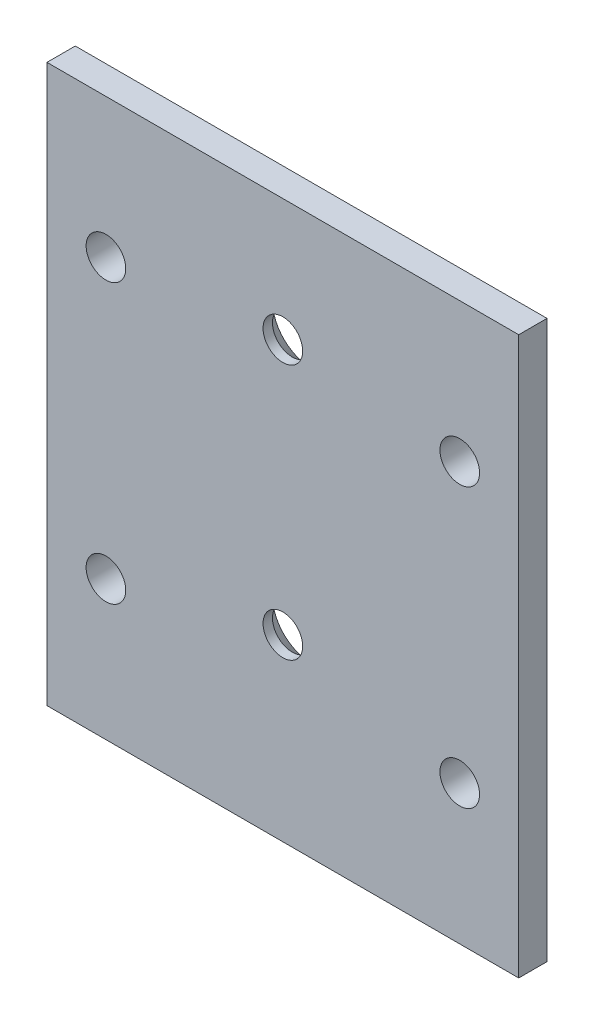
ISO-10303-21;
HEADER;
FILE_DESCRIPTION(('STEP AP214'),'2;1');
FILE_NAME('part.step','',(''),(''),'','','');
FILE_SCHEMA(('AUTOMOTIVE_DESIGN { 1 0 10303 214 1 1 1 1 }'));
ENDSEC;
DATA;
#1=APPLICATION_CONTEXT('core data for automotive mechanical design processes');
#2=APPLICATION_PROTOCOL_DEFINITION('international standard','automotive_design',2000,#1);
#3=PRODUCT_CONTEXT('',#1,'mechanical');
#4=PRODUCT('Part','Part','',(#3));
#5=PRODUCT_RELATED_PRODUCT_CATEGORY('part','',(#4));
#6=PRODUCT_DEFINITION_FORMATION('','',#4);
#7=PRODUCT_DEFINITION_CONTEXT('part definition',#1,'design');
#8=PRODUCT_DEFINITION('design','',#6,#7);
#9=PRODUCT_DEFINITION_SHAPE('','',#8);
#10=(LENGTH_UNIT() NAMED_UNIT(*) SI_UNIT(.MILLI.,.METRE.));
#11=(NAMED_UNIT(*) PLANE_ANGLE_UNIT() SI_UNIT($,.RADIAN.));
#12=(NAMED_UNIT(*) SI_UNIT($,.STERADIAN.) SOLID_ANGLE_UNIT());
#13=UNCERTAINTY_MEASURE_WITH_UNIT(LENGTH_MEASURE(1.E-05),#10,'distance_accuracy_value','');
#14=(GEOMETRIC_REPRESENTATION_CONTEXT(3) GLOBAL_UNCERTAINTY_ASSIGNED_CONTEXT((#13)) GLOBAL_UNIT_ASSIGNED_CONTEXT((#10,
#11,#12)) REPRESENTATION_CONTEXT('',''));
#15=CARTESIAN_POINT('',(0.,0.,0.));
#16=DIRECTION('',(0.,0.,1.));
#17=DIRECTION('',(1.,0.,0.));
#18=AXIS2_PLACEMENT_3D('',#15,#16,#17);
#19=CARTESIAN_POINT('',(0.,0.,3.));
#20=DIRECTION('',(0.,0.,1.));
#21=DIRECTION('',(1.,0.,0.));
#22=AXIS2_PLACEMENT_3D('',#19,#20,#21);
#23=PLANE('',#22);
#24=CARTESIAN_POINT('',(-18.75,27.5632384467491,3.));
#25=DIRECTION('',(0.,0.,1.));
#26=DIRECTION('',(-1.,0.,0.));
#27=AXIS2_PLACEMENT_3D('',#24,#25,#26);
#28=CIRCLE('',#27,2.1);
#29=CARTESIAN_POINT('',(-20.85,27.5632384467491,3.));
#30=VERTEX_POINT('',#29);
#31=EDGE_CURVE('E158',#30,#30,#28,.T.);
#32=ORIENTED_EDGE('',*,*,#31,.F.);
#33=EDGE_LOOP('',(#32));
#34=FACE_BOUND('',#33,.T.);
#35=CARTESIAN_POINT('',(18.75,57.0860055142034,3.));
#36=DIRECTION('',(0.,0.,1.));
#37=DIRECTION('',(1.,0.,0.));
#38=AXIS2_PLACEMENT_3D('',#35,#36,#37);
#39=CIRCLE('',#38,2.1);
#40=CARTESIAN_POINT('',(20.85,57.0860055142034,3.));
#41=VERTEX_POINT('',#40);
#42=EDGE_CURVE('E166',#41,#41,#39,.T.);
#43=ORIENTED_EDGE('',*,*,#42,.F.);
#44=EDGE_LOOP('',(#43));
#45=FACE_BOUND('',#44,.T.);
#46=CARTESIAN_POINT('',(0.,58.8947330899759,3.));
#47=DIRECTION('',(0.,0.,1.));
#48=DIRECTION('',(1.,0.,0.));
#49=AXIS2_PLACEMENT_3D('',#46,#47,#48);
#50=CIRCLE('',#49,2.1);
#51=CARTESIAN_POINT('',(2.1,58.8947330899759,3.));
#52=VERTEX_POINT('',#51);
#53=EDGE_CURVE('E104',#52,#52,#50,.T.);
#54=ORIENTED_EDGE('',*,*,#53,.F.);
#55=EDGE_LOOP('',(#54));
#56=FACE_BOUND('',#55,.T.);
#57=DIRECTION('',(-1.,0.,0.));
#58=VECTOR('',#57,1.);
#59=CARTESIAN_POINT('',(0.,71.8473890479305,3.));
#60=LINE('',#59,#58);
#61=CARTESIAN_POINT('',(25.,71.8473890479305,3.));
#62=VERTEX_POINT('',#61);
#63=CARTESIAN_POINT('',(-25.,71.8473890479305,3.));
#64=VERTEX_POINT('',#63);
#65=EDGE_CURVE('E50',#62,#64,#60,.T.);
#66=ORIENTED_EDGE('',*,*,#65,.T.);
#67=DIRECTION('',(0.,-1.,0.));
#68=VECTOR('',#67,1.);
#69=CARTESIAN_POINT('',(-25.,71.8473890479305,3.));
#70=LINE('',#69,#68);
#71=CARTESIAN_POINT('',(-25.,12.801854913022,3.));
#72=VERTEX_POINT('',#71);
#73=EDGE_CURVE('E81',#64,#72,#70,.T.);
#74=ORIENTED_EDGE('',*,*,#73,.T.);
#75=DIRECTION('',(1.,0.,0.));
#76=VECTOR('',#75,1.);
#77=CARTESIAN_POINT('',(-25.,12.801854913022,3.));
#78=LINE('',#77,#76);
#79=CARTESIAN_POINT('',(25.,12.801854913022,3.));
#80=VERTEX_POINT('',#79);
#81=EDGE_CURVE('E85',#72,#80,#78,.T.);
#82=ORIENTED_EDGE('',*,*,#81,.T.);
#83=DIRECTION('',(0.,1.,0.));
#84=VECTOR('',#83,1.);
#85=CARTESIAN_POINT('',(25.,71.8473890479305,3.));
#86=LINE('',#85,#84);
#87=EDGE_CURVE('E97',#80,#62,#86,.T.);
#88=ORIENTED_EDGE('',*,*,#87,.T.);
#89=EDGE_LOOP('',(#66,#74,#82,#88));
#90=FACE_BOUND('',#89,.T.);
#91=CARTESIAN_POINT('',(0.,31.8036255102108,3.));
#92=DIRECTION('',(0.,0.,1.));
#93=DIRECTION('',(1.,0.,0.));
#94=AXIS2_PLACEMENT_3D('',#91,#92,#93);
#95=CIRCLE('',#94,2.1);
#96=CARTESIAN_POINT('',(2.1,31.8036255102108,3.));
#97=VERTEX_POINT('',#96);
#98=EDGE_CURVE('E169',#97,#97,#95,.T.);
#99=ORIENTED_EDGE('',*,*,#98,.F.);
#100=EDGE_LOOP('',(#99));
#101=FACE_BOUND('',#100,.T.);
#102=CARTESIAN_POINT('',(18.75,27.5632384467491,3.));
#103=DIRECTION('',(0.,0.,1.));
#104=DIRECTION('',(1.,0.,0.));
#105=AXIS2_PLACEMENT_3D('',#102,#103,#104);
#106=CIRCLE('',#105,2.1);
#107=CARTESIAN_POINT('',(20.85,27.5632384467491,3.));
#108=VERTEX_POINT('',#107);
#109=EDGE_CURVE('E162',#108,#108,#106,.T.);
#110=ORIENTED_EDGE('',*,*,#109,.F.);
#111=EDGE_LOOP('',(#110));
#112=FACE_BOUND('',#111,.T.);
#113=CARTESIAN_POINT('',(-18.75,57.0860055142034,3.));
#114=DIRECTION('',(0.,0.,1.));
#115=DIRECTION('',(-1.,0.,0.));
#116=AXIS2_PLACEMENT_3D('',#113,#114,#115);
#117=CIRCLE('',#116,2.1);
#118=CARTESIAN_POINT('',(-20.85,57.0860055142034,3.));
#119=VERTEX_POINT('',#118);
#120=EDGE_CURVE('E153',#119,#119,#117,.T.);
#121=ORIENTED_EDGE('',*,*,#120,.F.);
#122=EDGE_LOOP('',(#121));
#123=FACE_BOUND('',#122,.T.);
#124=ADVANCED_FACE('F33',(#34,#45,#56,#90,#101,#112,#123),#23,.T.);
#125=CARTESIAN_POINT('',(0.,0.,0.));
#126=DIRECTION('',(0.,0.,1.));
#127=DIRECTION('',(1.,0.,0.));
#128=AXIS2_PLACEMENT_3D('',#125,#126,#127);
#129=PLANE('',#128);
#130=CARTESIAN_POINT('',(0.,31.8036255102108,0.));
#131=DIRECTION('',(0.,0.,1.));
#132=DIRECTION('',(1.,0.,0.));
#133=AXIS2_PLACEMENT_3D('',#130,#131,#132);
#134=CIRCLE('',#133,4.09999999999999);
#135=CARTESIAN_POINT('',(4.09999999999999,31.8036255102108,0.));
#136=VERTEX_POINT('',#135);
#137=EDGE_CURVE('E115',#136,#136,#134,.T.);
#138=ORIENTED_EDGE('',*,*,#137,.T.);
#139=EDGE_LOOP('',(#138));
#140=FACE_BOUND('',#139,.T.);
#141=CARTESIAN_POINT('',(0.,58.8947330899759,0.));
#142=DIRECTION('',(0.,0.,1.));
#143=DIRECTION('',(1.,0.,0.));
#144=AXIS2_PLACEMENT_3D('',#141,#142,#143);
#145=CIRCLE('',#144,4.09999999999999);
#146=CARTESIAN_POINT('',(4.09999999999999,58.8947330899759,0.));
#147=VERTEX_POINT('',#146);
#148=EDGE_CURVE('E112',#147,#147,#145,.T.);
#149=ORIENTED_EDGE('',*,*,#148,.T.);
#150=EDGE_LOOP('',(#149));
#151=FACE_BOUND('',#150,.T.);
#152=DIRECTION('',(0.,-1.,0.));
#153=VECTOR('',#152,1.);
#154=CARTESIAN_POINT('',(-25.,71.8473890479305,0.));
#155=LINE('',#154,#153);
#156=CARTESIAN_POINT('',(-25.,71.8473890479305,0.));
#157=VERTEX_POINT('',#156);
#158=CARTESIAN_POINT('',(-25.,12.801854913022,0.));
#159=VERTEX_POINT('',#158);
#160=EDGE_CURVE('E91',#157,#159,#155,.T.);
#161=ORIENTED_EDGE('',*,*,#160,.F.);
#162=DIRECTION('',(-1.,0.,0.));
#163=VECTOR('',#162,1.);
#164=CARTESIAN_POINT('',(0.,71.8473890479305,0.));
#165=LINE('',#164,#163);
#166=CARTESIAN_POINT('',(25.,71.8473890479305,0.));
#167=VERTEX_POINT('',#166);
#168=EDGE_CURVE('E107',#167,#157,#165,.T.);
#169=ORIENTED_EDGE('',*,*,#168,.F.);
#170=DIRECTION('',(0.,1.,0.));
#171=VECTOR('',#170,1.);
#172=CARTESIAN_POINT('',(25.,71.8473890479305,0.));
#173=LINE('',#172,#171);
#174=CARTESIAN_POINT('',(25.,12.801854913022,0.));
#175=VERTEX_POINT('',#174);
#176=EDGE_CURVE('E74',#175,#167,#173,.T.);
#177=ORIENTED_EDGE('',*,*,#176,.F.);
#178=DIRECTION('',(1.,0.,0.));
#179=VECTOR('',#178,1.);
#180=CARTESIAN_POINT('',(25.,12.801854913022,0.));
#181=LINE('',#180,#179);
#182=EDGE_CURVE('E67',#159,#175,#181,.T.);
#183=ORIENTED_EDGE('',*,*,#182,.F.);
#184=EDGE_LOOP('',(#161,#169,#177,#183));
#185=FACE_BOUND('',#184,.T.);
#186=CARTESIAN_POINT('',(18.75,57.0860055142034,0.));
#187=DIRECTION('',(0.,0.,1.));
#188=DIRECTION('',(1.,0.,0.));
#189=AXIS2_PLACEMENT_3D('',#186,#187,#188);
#190=CIRCLE('',#189,2.1);
#191=CARTESIAN_POINT('',(20.85,57.0860055142034,0.));
#192=VERTEX_POINT('',#191);
#193=EDGE_CURVE('E140',#192,#192,#190,.T.);
#194=ORIENTED_EDGE('',*,*,#193,.T.);
#195=EDGE_LOOP('',(#194));
#196=FACE_BOUND('',#195,.T.);
#197=CARTESIAN_POINT('',(18.75,27.5632384467491,0.));
#198=DIRECTION('',(0.,0.,1.));
#199=DIRECTION('',(1.,0.,0.));
#200=AXIS2_PLACEMENT_3D('',#197,#198,#199);
#201=CIRCLE('',#200,2.1);
#202=CARTESIAN_POINT('',(20.85,27.5632384467491,0.));
#203=VERTEX_POINT('',#202);
#204=EDGE_CURVE('E144',#203,#203,#201,.T.);
#205=ORIENTED_EDGE('',*,*,#204,.T.);
#206=EDGE_LOOP('',(#205));
#207=FACE_BOUND('',#206,.T.);
#208=CARTESIAN_POINT('',(-18.75,27.5632384467491,0.));
#209=DIRECTION('',(0.,0.,1.));
#210=DIRECTION('',(-1.,0.,0.));
#211=AXIS2_PLACEMENT_3D('',#208,#209,#210);
#212=CIRCLE('',#211,2.1);
#213=CARTESIAN_POINT('',(-20.85,27.5632384467491,0.));
#214=VERTEX_POINT('',#213);
#215=EDGE_CURVE('E148',#214,#214,#212,.T.);
#216=ORIENTED_EDGE('',*,*,#215,.T.);
#217=EDGE_LOOP('',(#216));
#218=FACE_BOUND('',#217,.T.);
#219=CARTESIAN_POINT('',(-18.75,57.0860055142034,0.));
#220=DIRECTION('',(0.,0.,1.));
#221=DIRECTION('',(-1.,0.,0.));
#222=AXIS2_PLACEMENT_3D('',#219,#220,#221);
#223=CIRCLE('',#222,2.1);
#224=CARTESIAN_POINT('',(-20.85,57.0860055142034,0.));
#225=VERTEX_POINT('',#224);
#226=EDGE_CURVE('E151',#225,#225,#223,.T.);
#227=ORIENTED_EDGE('',*,*,#226,.T.);
#228=EDGE_LOOP('',(#227));
#229=FACE_BOUND('',#228,.T.);
#230=ADVANCED_FACE('F129',(#140,#151,#185,#196,#207,#218,#229),#129,.F.);
#231=CARTESIAN_POINT('',(-25.,71.8473890479305,3.));
#232=DIRECTION('',(1.,0.,0.));
#233=DIRECTION('',(0.,1.,0.));
#234=AXIS2_PLACEMENT_3D('',#231,#232,#233);
#235=PLANE('',#234);
#236=ORIENTED_EDGE('',*,*,#160,.T.);
#237=DIRECTION('',(0.,0.,-1.));
#238=VECTOR('',#237,1.);
#239=CARTESIAN_POINT('',(-25.,12.801854913022,3.));
#240=LINE('',#239,#238);
#241=EDGE_CURVE('E88',#72,#159,#240,.T.);
#242=ORIENTED_EDGE('',*,*,#241,.F.);
#243=ORIENTED_EDGE('',*,*,#73,.F.);
#244=DIRECTION('',(0.,0.,-1.));
#245=VECTOR('',#244,1.);
#246=CARTESIAN_POINT('',(-25.,71.8473890479305,3.));
#247=LINE('',#246,#245);
#248=EDGE_CURVE('E92',#64,#157,#247,.T.);
#249=ORIENTED_EDGE('',*,*,#248,.T.);
#250=EDGE_LOOP('',(#236,#242,#243,#249));
#251=FACE_BOUND('',#250,.T.);
#252=ADVANCED_FACE('F89',(#251),#235,.F.);
#253=CARTESIAN_POINT('',(25.,12.801854913022,3.));
#254=DIRECTION('',(0.,1.,0.));
#255=DIRECTION('',(-1.,0.,0.));
#256=AXIS2_PLACEMENT_3D('',#253,#254,#255);
#257=PLANE('',#256);
#258=ORIENTED_EDGE('',*,*,#182,.T.);
#259=DIRECTION('',(0.,0.,-1.));
#260=VECTOR('',#259,1.);
#261=CARTESIAN_POINT('',(25.,12.801854913022,3.));
#262=LINE('',#261,#260);
#263=EDGE_CURVE('E93',#80,#175,#262,.T.);
#264=ORIENTED_EDGE('',*,*,#263,.F.);
#265=ORIENTED_EDGE('',*,*,#81,.F.);
#266=ORIENTED_EDGE('',*,*,#241,.T.);
#267=EDGE_LOOP('',(#258,#264,#265,#266));
#268=FACE_BOUND('',#267,.T.);
#269=ADVANCED_FACE('F95',(#268),#257,.F.);
#270=CARTESIAN_POINT('',(25.,71.8473890479305,3.));
#271=DIRECTION('',(-1.,0.,0.));
#272=DIRECTION('',(0.,-1.,0.));
#273=AXIS2_PLACEMENT_3D('',#270,#271,#272);
#274=PLANE('',#273);
#275=ORIENTED_EDGE('',*,*,#176,.T.);
#276=DIRECTION('',(0.,0.,-1.));
#277=VECTOR('',#276,1.);
#278=CARTESIAN_POINT('',(25.,71.8473890479305,3.));
#279=LINE('',#278,#277);
#280=EDGE_CURVE('E99',#62,#167,#279,.T.);
#281=ORIENTED_EDGE('',*,*,#280,.F.);
#282=ORIENTED_EDGE('',*,*,#87,.F.);
#283=ORIENTED_EDGE('',*,*,#263,.T.);
#284=EDGE_LOOP('',(#275,#281,#282,#283));
#285=FACE_BOUND('',#284,.T.);
#286=ADVANCED_FACE('F191',(#285),#274,.F.);
#287=CARTESIAN_POINT('',(0.,71.8473890479305,3.));
#288=DIRECTION('',(0.,-1.,0.));
#289=DIRECTION('',(0.,0.,-1.));
#290=AXIS2_PLACEMENT_3D('',#287,#288,#289);
#291=PLANE('',#290);
#292=ORIENTED_EDGE('',*,*,#168,.T.);
#293=ORIENTED_EDGE('',*,*,#248,.F.);
#294=ORIENTED_EDGE('',*,*,#65,.F.);
#295=ORIENTED_EDGE('',*,*,#280,.T.);
#296=EDGE_LOOP('',(#292,#293,#294,#295));
#297=FACE_BOUND('',#296,.T.);
#298=ADVANCED_FACE('F188',(#297),#291,.F.);
#299=CARTESIAN_POINT('',(0.,58.8947330899759,3.));
#300=DIRECTION('',(0.,0.,-1.));
#301=DIRECTION('',(-1.,0.,0.));
#302=AXIS2_PLACEMENT_3D('',#299,#300,#301);
#303=CYLINDRICAL_SURFACE('',#302,2.1);
#304=CARTESIAN_POINT('',(0.,58.8947330899759,2.));
#305=DIRECTION('',(0.,0.,1.));
#306=DIRECTION('',(1.,0.,0.));
#307=AXIS2_PLACEMENT_3D('',#304,#305,#306);
#308=CIRCLE('',#307,2.1);
#309=CARTESIAN_POINT('',(2.1,58.8947330899759,2.));
#310=VERTEX_POINT('',#309);
#311=EDGE_CURVE('E11',#310,#310,#308,.F.);
#312=ORIENTED_EDGE('',*,*,#311,.T.);
#313=EDGE_LOOP('',(#312));
#314=FACE_BOUND('',#313,.T.);
#315=ORIENTED_EDGE('',*,*,#53,.T.);
#316=EDGE_LOOP('',(#315));
#317=FACE_BOUND('',#316,.T.);
#318=ADVANCED_FACE('F176',(#314,#317),#303,.F.);
#319=CARTESIAN_POINT('',(0.,31.8036255102108,3.));
#320=DIRECTION('',(0.,0.,-1.));
#321=DIRECTION('',(-1.,0.,0.));
#322=AXIS2_PLACEMENT_3D('',#319,#320,#321);
#323=CYLINDRICAL_SURFACE('',#322,2.1);
#324=CARTESIAN_POINT('',(0.,31.8036255102108,2.));
#325=DIRECTION('',(0.,0.,1.));
#326=DIRECTION('',(1.,0.,0.));
#327=AXIS2_PLACEMENT_3D('',#324,#325,#326);
#328=CIRCLE('',#327,2.1);
#329=CARTESIAN_POINT('',(2.1,31.8036255102108,2.));
#330=VERTEX_POINT('',#329);
#331=EDGE_CURVE('E42',#330,#330,#328,.F.);
#332=ORIENTED_EDGE('',*,*,#331,.T.);
#333=EDGE_LOOP('',(#332));
#334=FACE_BOUND('',#333,.T.);
#335=ORIENTED_EDGE('',*,*,#98,.T.);
#336=EDGE_LOOP('',(#335));
#337=FACE_BOUND('',#336,.T.);
#338=ADVANCED_FACE('F120',(#334,#337),#323,.F.);
#339=CARTESIAN_POINT('',(18.75,57.0860055142034,3.));
#340=DIRECTION('',(0.,0.,-1.));
#341=DIRECTION('',(-1.,0.,0.));
#342=AXIS2_PLACEMENT_3D('',#339,#340,#341);
#343=CYLINDRICAL_SURFACE('',#342,2.1);
#344=ORIENTED_EDGE('',*,*,#42,.T.);
#345=EDGE_LOOP('',(#344));
#346=FACE_BOUND('',#345,.T.);
#347=ORIENTED_EDGE('',*,*,#193,.F.);
#348=EDGE_LOOP('',(#347));
#349=FACE_BOUND('',#348,.T.);
#350=ADVANCED_FACE('F226',(#346,#349),#343,.F.);
#351=CARTESIAN_POINT('',(18.75,27.5632384467491,3.));
#352=DIRECTION('',(0.,0.,-1.));
#353=DIRECTION('',(-1.,0.,0.));
#354=AXIS2_PLACEMENT_3D('',#351,#352,#353);
#355=CYLINDRICAL_SURFACE('',#354,2.1);
#356=ORIENTED_EDGE('',*,*,#109,.T.);
#357=EDGE_LOOP('',(#356));
#358=FACE_BOUND('',#357,.T.);
#359=ORIENTED_EDGE('',*,*,#204,.F.);
#360=EDGE_LOOP('',(#359));
#361=FACE_BOUND('',#360,.T.);
#362=ADVANCED_FACE('F232',(#358,#361),#355,.F.);
#363=CARTESIAN_POINT('',(-18.75,27.5632384467491,3.));
#364=DIRECTION('',(0.,0.,-1.));
#365=DIRECTION('',(-1.,0.,0.));
#366=AXIS2_PLACEMENT_3D('',#363,#364,#365);
#367=CYLINDRICAL_SURFACE('',#366,2.1);
#368=ORIENTED_EDGE('',*,*,#31,.T.);
#369=EDGE_LOOP('',(#368));
#370=FACE_BOUND('',#369,.T.);
#371=ORIENTED_EDGE('',*,*,#215,.F.);
#372=EDGE_LOOP('',(#371));
#373=FACE_BOUND('',#372,.T.);
#374=ADVANCED_FACE('F240',(#370,#373),#367,.F.);
#375=CARTESIAN_POINT('',(-18.75,57.0860055142034,3.));
#376=DIRECTION('',(0.,0.,-1.));
#377=DIRECTION('',(-1.,0.,0.));
#378=AXIS2_PLACEMENT_3D('',#375,#376,#377);
#379=CYLINDRICAL_SURFACE('',#378,2.1);
#380=ORIENTED_EDGE('',*,*,#120,.T.);
#381=EDGE_LOOP('',(#380));
#382=FACE_BOUND('',#381,.T.);
#383=ORIENTED_EDGE('',*,*,#226,.F.);
#384=EDGE_LOOP('',(#383));
#385=FACE_BOUND('',#384,.T.);
#386=ADVANCED_FACE('F126',(#382,#385),#379,.F.);
#387=CARTESIAN_POINT('',(0.,31.8036255102108,0.));
#388=DIRECTION('',(0.,0.,-1.));
#389=DIRECTION('',(-1.,0.,0.));
#390=AXIS2_PLACEMENT_3D('',#387,#388,#389);
#391=CONICAL_SURFACE('',#390,4.09999999999999,0.785398163397447);
#392=ORIENTED_EDGE('',*,*,#331,.F.);
#393=EDGE_LOOP('',(#392));
#394=FACE_BOUND('',#393,.T.);
#395=ORIENTED_EDGE('',*,*,#137,.F.);
#396=EDGE_LOOP('',(#395));
#397=FACE_BOUND('',#396,.T.);
#398=ADVANCED_FACE('F123',(#394,#397),#391,.F.);
#399=CARTESIAN_POINT('',(0.,58.8947330899759,0.));
#400=DIRECTION('',(0.,0.,-1.));
#401=DIRECTION('',(-1.,0.,0.));
#402=AXIS2_PLACEMENT_3D('',#399,#400,#401);
#403=CONICAL_SURFACE('',#402,4.09999999999999,0.785398163397447);
#404=ORIENTED_EDGE('',*,*,#311,.F.);
#405=EDGE_LOOP('',(#404));
#406=FACE_BOUND('',#405,.T.);
#407=ORIENTED_EDGE('',*,*,#148,.F.);
#408=EDGE_LOOP('',(#407));
#409=FACE_BOUND('',#408,.T.);
#410=ADVANCED_FACE('F35',(#406,#409),#403,.F.);
#411=CLOSED_SHELL('',(#124,#230,#252,#269,#286,#298,#318,#338,#350,#362,#374,#386,#398,#410));
#412=MANIFOLD_SOLID_BREP('B2',#411);
#413=ADVANCED_BREP_SHAPE_REPRESENTATION('',(#18,#412),#14);
#414=SHAPE_DEFINITION_REPRESENTATION(#9,#413);
ENDSEC;
END-ISO-10303-21;
